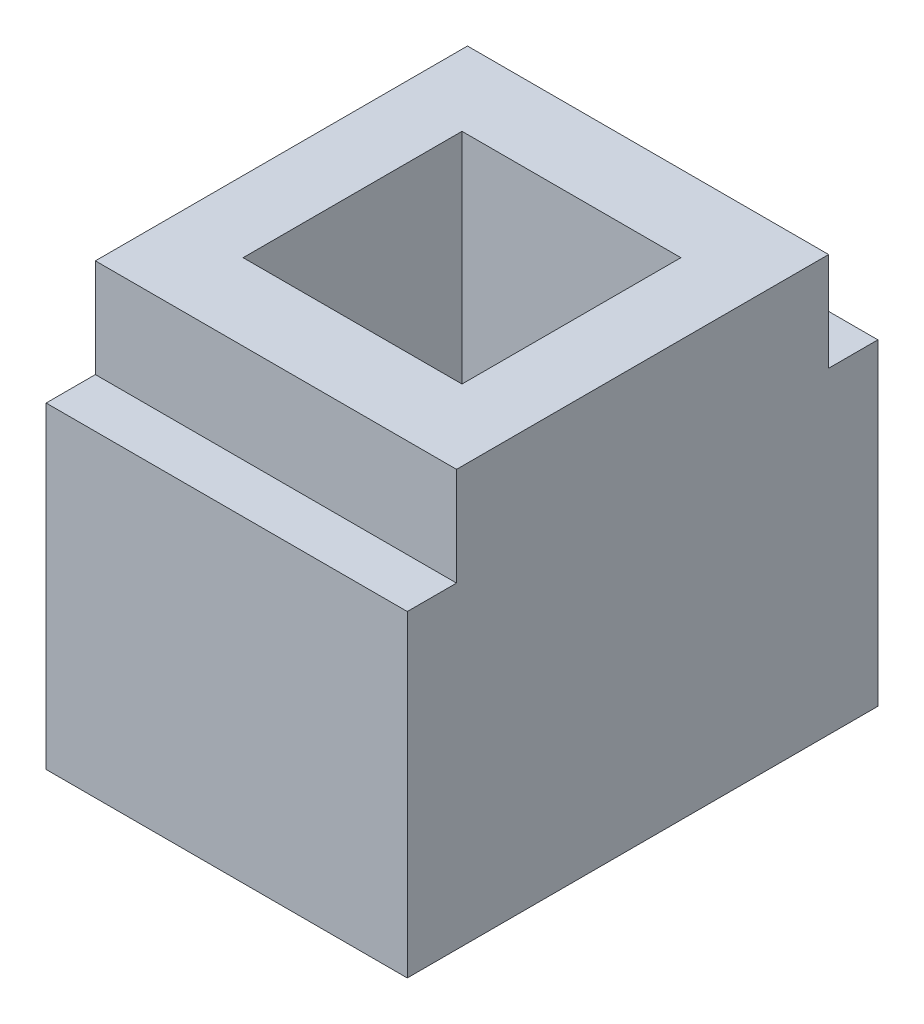
ISO-10303-21;
HEADER;
FILE_DESCRIPTION(('STEP AP214'),'2;1');
FILE_NAME('part.step','',(''),(''),'','','');
FILE_SCHEMA(('AUTOMOTIVE_DESIGN { 1 0 10303 214 1 1 1 1 }'));
ENDSEC;
DATA;
#1=APPLICATION_CONTEXT('core data for automotive mechanical design processes');
#2=APPLICATION_PROTOCOL_DEFINITION('international standard','automotive_design',2000,#1);
#3=PRODUCT_CONTEXT('',#1,'mechanical');
#4=PRODUCT('Part','Part','',(#3));
#5=PRODUCT_RELATED_PRODUCT_CATEGORY('part','',(#4));
#6=PRODUCT_DEFINITION_FORMATION('','',#4);
#7=PRODUCT_DEFINITION_CONTEXT('part definition',#1,'design');
#8=PRODUCT_DEFINITION('design','',#6,#7);
#9=PRODUCT_DEFINITION_SHAPE('','',#8);
#10=(LENGTH_UNIT() NAMED_UNIT(*) SI_UNIT(.MILLI.,.METRE.));
#11=(NAMED_UNIT(*) PLANE_ANGLE_UNIT() SI_UNIT($,.RADIAN.));
#12=(NAMED_UNIT(*) SI_UNIT($,.STERADIAN.) SOLID_ANGLE_UNIT());
#13=UNCERTAINTY_MEASURE_WITH_UNIT(LENGTH_MEASURE(1.E-05),#10,'distance_accuracy_value','');
#14=(GEOMETRIC_REPRESENTATION_CONTEXT(3) GLOBAL_UNCERTAINTY_ASSIGNED_CONTEXT((#13)) GLOBAL_UNIT_ASSIGNED_CONTEXT((#10,
#11,#12)) REPRESENTATION_CONTEXT('',''));
#15=CARTESIAN_POINT('',(0.,0.,0.));
#16=DIRECTION('',(0.,0.,1.));
#17=DIRECTION('',(1.,0.,0.));
#18=AXIS2_PLACEMENT_3D('',#15,#16,#17);
#19=CARTESIAN_POINT('',(33.,0.,-34.));
#20=DIRECTION('',(0.,0.,-1.));
#21=DIRECTION('',(-1.,0.,0.));
#22=AXIS2_PLACEMENT_3D('',#19,#20,#21);
#23=PLANE('',#22);
#24=DIRECTION('',(0.,-1.,0.));
#25=VECTOR('',#24,1.);
#26=CARTESIAN_POINT('',(-33.,0.,-34.));
#27=LINE('',#26,#25);
#28=CARTESIAN_POINT('',(-33.,38.,-34.));
#29=VERTEX_POINT('',#28);
#30=CARTESIAN_POINT('',(-33.,20.,-34.));
#31=VERTEX_POINT('',#30);
#32=EDGE_CURVE('E161',#29,#31,#27,.T.);
#33=ORIENTED_EDGE('',*,*,#32,.F.);
#34=DIRECTION('',(-1.,0.,0.));
#35=VECTOR('',#34,1.);
#36=CARTESIAN_POINT('',(33.,38.,-34.));
#37=LINE('',#36,#35);
#38=CARTESIAN_POINT('',(33.,38.,-34.));
#39=VERTEX_POINT('',#38);
#40=EDGE_CURVE('E11',#39,#29,#37,.T.);
#41=ORIENTED_EDGE('',*,*,#40,.F.);
#42=DIRECTION('',(0.,-1.,0.));
#43=VECTOR('',#42,1.);
#44=CARTESIAN_POINT('',(33.,0.,-34.));
#45=LINE('',#44,#43);
#46=CARTESIAN_POINT('',(33.,20.,-34.));
#47=VERTEX_POINT('',#46);
#48=EDGE_CURVE('E165',#39,#47,#45,.T.);
#49=ORIENTED_EDGE('',*,*,#48,.T.);
#50=DIRECTION('',(-1.,0.,0.));
#51=VECTOR('',#50,1.);
#52=CARTESIAN_POINT('',(33.,20.,-34.));
#53=LINE('',#52,#51);
#54=EDGE_CURVE('E186',#47,#31,#53,.T.);
#55=ORIENTED_EDGE('',*,*,#54,.T.);
#56=EDGE_LOOP('',(#33,#41,#49,#55));
#57=FACE_BOUND('',#56,.T.);
#58=ADVANCED_FACE('F41',(#57),#23,.T.);
#59=CARTESIAN_POINT('',(33.,38.,0.));
#60=DIRECTION('',(0.,1.,0.));
#61=DIRECTION('',(0.,0.,1.));
#62=AXIS2_PLACEMENT_3D('',#59,#60,#61);
#63=PLANE('',#62);
#64=DIRECTION('',(0.,0.,1.));
#65=VECTOR('',#64,1.);
#66=CARTESIAN_POINT('',(-20.,38.,-20.));
#67=LINE('',#66,#65);
#68=CARTESIAN_POINT('',(-20.,38.,-20.));
#69=VERTEX_POINT('',#68);
#70=CARTESIAN_POINT('',(-20.,38.,20.));
#71=VERTEX_POINT('',#70);
#72=EDGE_CURVE('E55',#69,#71,#67,.T.);
#73=ORIENTED_EDGE('',*,*,#72,.F.);
#74=DIRECTION('',(-1.,0.,0.));
#75=VECTOR('',#74,1.);
#76=CARTESIAN_POINT('',(-20.,38.,-20.));
#77=LINE('',#76,#75);
#78=CARTESIAN_POINT('',(20.,38.,-20.));
#79=VERTEX_POINT('',#78);
#80=EDGE_CURVE('E146',#79,#69,#77,.T.);
#81=ORIENTED_EDGE('',*,*,#80,.F.);
#82=DIRECTION('',(0.,0.,-1.));
#83=VECTOR('',#82,1.);
#84=CARTESIAN_POINT('',(20.,38.,-20.));
#85=LINE('',#84,#83);
#86=CARTESIAN_POINT('',(20.,38.,20.));
#87=VERTEX_POINT('',#86);
#88=EDGE_CURVE('E149',#87,#79,#85,.T.);
#89=ORIENTED_EDGE('',*,*,#88,.F.);
#90=DIRECTION('',(1.,0.,0.));
#91=VECTOR('',#90,1.);
#92=CARTESIAN_POINT('',(-20.,38.,20.));
#93=LINE('',#92,#91);
#94=EDGE_CURVE('E155',#71,#87,#93,.T.);
#95=ORIENTED_EDGE('',*,*,#94,.F.);
#96=EDGE_LOOP('',(#73,#81,#89,#95));
#97=FACE_BOUND('',#96,.T.);
#98=DIRECTION('',(0.,0.,-1.));
#99=VECTOR('',#98,1.);
#100=CARTESIAN_POINT('',(-33.,38.,0.));
#101=LINE('',#100,#99);
#102=CARTESIAN_POINT('',(-33.,38.,34.));
#103=VERTEX_POINT('',#102);
#104=EDGE_CURVE('E189',#103,#29,#101,.T.);
#105=ORIENTED_EDGE('',*,*,#104,.F.);
#106=DIRECTION('',(-1.,0.,0.));
#107=VECTOR('',#106,1.);
#108=CARTESIAN_POINT('',(33.,38.,34.));
#109=LINE('',#108,#107);
#110=CARTESIAN_POINT('',(33.,38.,34.));
#111=VERTEX_POINT('',#110);
#112=EDGE_CURVE('E48',#111,#103,#109,.T.);
#113=ORIENTED_EDGE('',*,*,#112,.F.);
#114=DIRECTION('',(0.,0.,-1.));
#115=VECTOR('',#114,1.);
#116=CARTESIAN_POINT('',(33.,38.,0.));
#117=LINE('',#116,#115);
#118=EDGE_CURVE('E168',#111,#39,#117,.T.);
#119=ORIENTED_EDGE('',*,*,#118,.T.);
#120=ORIENTED_EDGE('',*,*,#40,.T.);
#121=EDGE_LOOP('',(#105,#113,#119,#120));
#122=FACE_BOUND('',#121,.T.);
#123=ADVANCED_FACE('F231',(#97,#122),#63,.T.);
#124=CARTESIAN_POINT('',(33.,0.,34.));
#125=DIRECTION('',(0.,0.,-1.));
#126=DIRECTION('',(-1.,0.,0.));
#127=AXIS2_PLACEMENT_3D('',#124,#125,#126);
#128=PLANE('',#127);
#129=DIRECTION('',(0.,-1.,0.));
#130=VECTOR('',#129,1.);
#131=CARTESIAN_POINT('',(-33.,0.,34.));
#132=LINE('',#131,#130);
#133=CARTESIAN_POINT('',(-33.,20.,34.));
#134=VERTEX_POINT('',#133);
#135=EDGE_CURVE('E192',#103,#134,#132,.T.);
#136=ORIENTED_EDGE('',*,*,#135,.T.);
#137=DIRECTION('',(-1.,0.,0.));
#138=VECTOR('',#137,1.);
#139=CARTESIAN_POINT('',(33.,20.,34.));
#140=LINE('',#139,#138);
#141=CARTESIAN_POINT('',(33.,20.,34.));
#142=VERTEX_POINT('',#141);
#143=EDGE_CURVE('E218',#142,#134,#140,.T.);
#144=ORIENTED_EDGE('',*,*,#143,.F.);
#145=DIRECTION('',(0.,-1.,0.));
#146=VECTOR('',#145,1.);
#147=CARTESIAN_POINT('',(33.,0.,34.));
#148=LINE('',#147,#146);
#149=EDGE_CURVE('E172',#111,#142,#148,.T.);
#150=ORIENTED_EDGE('',*,*,#149,.F.);
#151=ORIENTED_EDGE('',*,*,#112,.T.);
#152=EDGE_LOOP('',(#136,#144,#150,#151));
#153=FACE_BOUND('',#152,.T.);
#154=ADVANCED_FACE('F222',(#153),#128,.F.);
#155=CARTESIAN_POINT('',(33.,20.,0.));
#156=DIRECTION('',(0.,1.,0.));
#157=DIRECTION('',(0.,0.,1.));
#158=AXIS2_PLACEMENT_3D('',#155,#156,#157);
#159=PLANE('',#158);
#160=DIRECTION('',(0.,0.,-1.));
#161=VECTOR('',#160,1.);
#162=CARTESIAN_POINT('',(-33.,20.,0.));
#163=LINE('',#162,#161);
#164=CARTESIAN_POINT('',(-33.,20.,43.));
#165=VERTEX_POINT('',#164);
#166=EDGE_CURVE('E195',#165,#134,#163,.T.);
#167=ORIENTED_EDGE('',*,*,#166,.F.);
#168=DIRECTION('',(-1.,0.,0.));
#169=VECTOR('',#168,1.);
#170=CARTESIAN_POINT('',(33.,20.,43.));
#171=LINE('',#170,#169);
#172=CARTESIAN_POINT('',(33.,20.,43.));
#173=VERTEX_POINT('',#172);
#174=EDGE_CURVE('E216',#173,#165,#171,.T.);
#175=ORIENTED_EDGE('',*,*,#174,.F.);
#176=DIRECTION('',(0.,0.,-1.));
#177=VECTOR('',#176,1.);
#178=CARTESIAN_POINT('',(33.,20.,0.));
#179=LINE('',#178,#177);
#180=EDGE_CURVE('E174',#173,#142,#179,.T.);
#181=ORIENTED_EDGE('',*,*,#180,.T.);
#182=ORIENTED_EDGE('',*,*,#143,.T.);
#183=EDGE_LOOP('',(#167,#175,#181,#182));
#184=FACE_BOUND('',#183,.T.);
#185=ADVANCED_FACE('F249',(#184),#159,.T.);
#186=CARTESIAN_POINT('',(33.,0.,43.));
#187=DIRECTION('',(0.,0.,-1.));
#188=DIRECTION('',(-1.,0.,0.));
#189=AXIS2_PLACEMENT_3D('',#186,#187,#188);
#190=PLANE('',#189);
#191=DIRECTION('',(0.,-1.,0.));
#192=VECTOR('',#191,1.);
#193=CARTESIAN_POINT('',(-33.,0.,43.));
#194=LINE('',#193,#192);
#195=CARTESIAN_POINT('',(-33.,-38.,43.));
#196=VERTEX_POINT('',#195);
#197=EDGE_CURVE('E198',#165,#196,#194,.T.);
#198=ORIENTED_EDGE('',*,*,#197,.T.);
#199=DIRECTION('',(-1.,0.,0.));
#200=VECTOR('',#199,1.);
#201=CARTESIAN_POINT('',(33.,-38.,43.));
#202=LINE('',#201,#200);
#203=CARTESIAN_POINT('',(33.,-38.,43.));
#204=VERTEX_POINT('',#203);
#205=EDGE_CURVE('E213',#204,#196,#202,.T.);
#206=ORIENTED_EDGE('',*,*,#205,.F.);
#207=DIRECTION('',(0.,-1.,0.));
#208=VECTOR('',#207,1.);
#209=CARTESIAN_POINT('',(33.,0.,43.));
#210=LINE('',#209,#208);
#211=EDGE_CURVE('E177',#173,#204,#210,.T.);
#212=ORIENTED_EDGE('',*,*,#211,.F.);
#213=ORIENTED_EDGE('',*,*,#174,.T.);
#214=EDGE_LOOP('',(#198,#206,#212,#213));
#215=FACE_BOUND('',#214,.T.);
#216=ADVANCED_FACE('F278',(#215),#190,.F.);
#217=CARTESIAN_POINT('',(33.,-38.,0.));
#218=DIRECTION('',(0.,1.,0.));
#219=DIRECTION('',(0.,0.,1.));
#220=AXIS2_PLACEMENT_3D('',#217,#218,#219);
#221=PLANE('',#220);
#222=DIRECTION('',(-1.,0.,0.));
#223=VECTOR('',#222,1.);
#224=CARTESIAN_POINT('',(-20.,-38.,-20.));
#225=LINE('',#224,#223);
#226=CARTESIAN_POINT('',(20.,-38.,-20.));
#227=VERTEX_POINT('',#226);
#228=CARTESIAN_POINT('',(-20.,-38.,-20.));
#229=VERTEX_POINT('',#228);
#230=EDGE_CURVE('E136',#227,#229,#225,.T.);
#231=ORIENTED_EDGE('',*,*,#230,.T.);
#232=DIRECTION('',(0.,0.,1.));
#233=VECTOR('',#232,1.);
#234=CARTESIAN_POINT('',(-20.,-38.,-20.));
#235=LINE('',#234,#233);
#236=CARTESIAN_POINT('',(-20.,-38.,20.));
#237=VERTEX_POINT('',#236);
#238=EDGE_CURVE('E130',#229,#237,#235,.T.);
#239=ORIENTED_EDGE('',*,*,#238,.T.);
#240=DIRECTION('',(1.,0.,0.));
#241=VECTOR('',#240,1.);
#242=CARTESIAN_POINT('',(-20.,-38.,20.));
#243=LINE('',#242,#241);
#244=CARTESIAN_POINT('',(20.,-38.,20.));
#245=VERTEX_POINT('',#244);
#246=EDGE_CURVE('E139',#237,#245,#243,.T.);
#247=ORIENTED_EDGE('',*,*,#246,.T.);
#248=DIRECTION('',(0.,0.,-1.));
#249=VECTOR('',#248,1.);
#250=CARTESIAN_POINT('',(20.,-38.,-20.));
#251=LINE('',#250,#249);
#252=EDGE_CURVE('E63',#245,#227,#251,.T.);
#253=ORIENTED_EDGE('',*,*,#252,.T.);
#254=EDGE_LOOP('',(#231,#239,#247,#253));
#255=FACE_BOUND('',#254,.T.);
#256=DIRECTION('',(0.,0.,-1.));
#257=VECTOR('',#256,1.);
#258=CARTESIAN_POINT('',(-33.,-38.,0.));
#259=LINE('',#258,#257);
#260=CARTESIAN_POINT('',(-33.,-38.,-43.));
#261=VERTEX_POINT('',#260);
#262=EDGE_CURVE('E200',#196,#261,#259,.T.);
#263=ORIENTED_EDGE('',*,*,#262,.T.);
#264=DIRECTION('',(-1.,0.,0.));
#265=VECTOR('',#264,1.);
#266=CARTESIAN_POINT('',(33.,-38.,-43.));
#267=LINE('',#266,#265);
#268=CARTESIAN_POINT('',(33.,-38.,-43.));
#269=VERTEX_POINT('',#268);
#270=EDGE_CURVE('E211',#269,#261,#267,.T.);
#271=ORIENTED_EDGE('',*,*,#270,.F.);
#272=DIRECTION('',(0.,0.,-1.));
#273=VECTOR('',#272,1.);
#274=CARTESIAN_POINT('',(33.,-38.,0.));
#275=LINE('',#274,#273);
#276=EDGE_CURVE('E179',#204,#269,#275,.T.);
#277=ORIENTED_EDGE('',*,*,#276,.F.);
#278=ORIENTED_EDGE('',*,*,#205,.T.);
#279=EDGE_LOOP('',(#263,#271,#277,#278));
#280=FACE_BOUND('',#279,.T.);
#281=ADVANCED_FACE('F143',(#255,#280),#221,.F.);
#282=CARTESIAN_POINT('',(33.,0.,-43.));
#283=DIRECTION('',(0.,0.,-1.));
#284=DIRECTION('',(-1.,0.,0.));
#285=AXIS2_PLACEMENT_3D('',#282,#283,#284);
#286=PLANE('',#285);
#287=DIRECTION('',(0.,-1.,0.));
#288=VECTOR('',#287,1.);
#289=CARTESIAN_POINT('',(-33.,0.,-43.));
#290=LINE('',#289,#288);
#291=CARTESIAN_POINT('',(-33.,20.,-43.));
#292=VERTEX_POINT('',#291);
#293=EDGE_CURVE('E203',#292,#261,#290,.T.);
#294=ORIENTED_EDGE('',*,*,#293,.F.);
#295=DIRECTION('',(-1.,0.,0.));
#296=VECTOR('',#295,1.);
#297=CARTESIAN_POINT('',(33.,20.,-43.));
#298=LINE('',#297,#296);
#299=CARTESIAN_POINT('',(33.,20.,-43.));
#300=VERTEX_POINT('',#299);
#301=EDGE_CURVE('E209',#300,#292,#298,.T.);
#302=ORIENTED_EDGE('',*,*,#301,.F.);
#303=DIRECTION('',(0.,-1.,0.));
#304=VECTOR('',#303,1.);
#305=CARTESIAN_POINT('',(33.,0.,-43.));
#306=LINE('',#305,#304);
#307=EDGE_CURVE('E181',#300,#269,#306,.T.);
#308=ORIENTED_EDGE('',*,*,#307,.T.);
#309=ORIENTED_EDGE('',*,*,#270,.T.);
#310=EDGE_LOOP('',(#294,#302,#308,#309));
#311=FACE_BOUND('',#310,.T.);
#312=ADVANCED_FACE('F241',(#311),#286,.T.);
#313=CARTESIAN_POINT('',(33.,20.,0.));
#314=DIRECTION('',(0.,-1.,0.));
#315=DIRECTION('',(0.,0.,-1.));
#316=AXIS2_PLACEMENT_3D('',#313,#314,#315);
#317=PLANE('',#316);
#318=DIRECTION('',(0.,0.,1.));
#319=VECTOR('',#318,1.);
#320=CARTESIAN_POINT('',(-33.,20.,0.));
#321=LINE('',#320,#319);
#322=EDGE_CURVE('E169',#292,#31,#321,.T.);
#323=ORIENTED_EDGE('',*,*,#322,.T.);
#324=ORIENTED_EDGE('',*,*,#54,.F.);
#325=DIRECTION('',(0.,0.,1.));
#326=VECTOR('',#325,1.);
#327=CARTESIAN_POINT('',(33.,20.,0.));
#328=LINE('',#327,#326);
#329=EDGE_CURVE('E184',#300,#47,#328,.T.);
#330=ORIENTED_EDGE('',*,*,#329,.F.);
#331=ORIENTED_EDGE('',*,*,#301,.T.);
#332=EDGE_LOOP('',(#323,#324,#330,#331));
#333=FACE_BOUND('',#332,.T.);
#334=ADVANCED_FACE('F254',(#333),#317,.F.);
#335=CARTESIAN_POINT('',(33.,0.,0.));
#336=DIRECTION('',(1.,0.,0.));
#337=DIRECTION('',(0.,0.,-1.));
#338=AXIS2_PLACEMENT_3D('',#335,#336,#337);
#339=PLANE('',#338);
#340=ORIENTED_EDGE('',*,*,#48,.F.);
#341=ORIENTED_EDGE('',*,*,#118,.F.);
#342=ORIENTED_EDGE('',*,*,#149,.T.);
#343=ORIENTED_EDGE('',*,*,#180,.F.);
#344=ORIENTED_EDGE('',*,*,#211,.T.);
#345=ORIENTED_EDGE('',*,*,#276,.T.);
#346=ORIENTED_EDGE('',*,*,#307,.F.);
#347=ORIENTED_EDGE('',*,*,#329,.T.);
#348=EDGE_LOOP('',(#340,#341,#342,#343,#344,#345,#346,#347));
#349=FACE_BOUND('',#348,.T.);
#350=ADVANCED_FACE('F253',(#349),#339,.T.);
#351=CARTESIAN_POINT('',(-33.,0.,0.));
#352=DIRECTION('',(1.,0.,0.));
#353=DIRECTION('',(0.,0.,-1.));
#354=AXIS2_PLACEMENT_3D('',#351,#352,#353);
#355=PLANE('',#354);
#356=ORIENTED_EDGE('',*,*,#32,.T.);
#357=ORIENTED_EDGE('',*,*,#322,.F.);
#358=ORIENTED_EDGE('',*,*,#293,.T.);
#359=ORIENTED_EDGE('',*,*,#262,.F.);
#360=ORIENTED_EDGE('',*,*,#197,.F.);
#361=ORIENTED_EDGE('',*,*,#166,.T.);
#362=ORIENTED_EDGE('',*,*,#135,.F.);
#363=ORIENTED_EDGE('',*,*,#104,.T.);
#364=EDGE_LOOP('',(#356,#357,#358,#359,#360,#361,#362,#363));
#365=FACE_BOUND('',#364,.T.);
#366=ADVANCED_FACE('F228',(#365),#355,.F.);
#367=CARTESIAN_POINT('',(-20.,-38.,-20.));
#368=DIRECTION('',(-1.,0.,0.));
#369=DIRECTION('',(0.,0.,1.));
#370=AXIS2_PLACEMENT_3D('',#367,#368,#369);
#371=PLANE('',#370);
#372=ORIENTED_EDGE('',*,*,#72,.T.);
#373=DIRECTION('',(0.,1.,0.));
#374=VECTOR('',#373,1.);
#375=CARTESIAN_POINT('',(-20.,-38.,20.));
#376=LINE('',#375,#374);
#377=EDGE_CURVE('E126',#237,#71,#376,.T.);
#378=ORIENTED_EDGE('',*,*,#377,.F.);
#379=ORIENTED_EDGE('',*,*,#238,.F.);
#380=DIRECTION('',(0.,1.,0.));
#381=VECTOR('',#380,1.);
#382=CARTESIAN_POINT('',(-20.,-38.,-20.));
#383=LINE('',#382,#381);
#384=EDGE_CURVE('E159',#229,#69,#383,.T.);
#385=ORIENTED_EDGE('',*,*,#384,.T.);
#386=EDGE_LOOP('',(#372,#378,#379,#385));
#387=FACE_BOUND('',#386,.T.);
#388=ADVANCED_FACE('F128',(#387),#371,.F.);
#389=CARTESIAN_POINT('',(-20.,-38.,-20.));
#390=DIRECTION('',(0.,0.,-1.));
#391=DIRECTION('',(-1.,0.,0.));
#392=AXIS2_PLACEMENT_3D('',#389,#390,#391);
#393=PLANE('',#392);
#394=ORIENTED_EDGE('',*,*,#80,.T.);
#395=ORIENTED_EDGE('',*,*,#384,.F.);
#396=ORIENTED_EDGE('',*,*,#230,.F.);
#397=DIRECTION('',(0.,1.,0.));
#398=VECTOR('',#397,1.);
#399=CARTESIAN_POINT('',(20.,-38.,-20.));
#400=LINE('',#399,#398);
#401=EDGE_CURVE('E162',#227,#79,#400,.T.);
#402=ORIENTED_EDGE('',*,*,#401,.T.);
#403=EDGE_LOOP('',(#394,#395,#396,#402));
#404=FACE_BOUND('',#403,.T.);
#405=ADVANCED_FACE('F291',(#404),#393,.F.);
#406=CARTESIAN_POINT('',(20.,-38.,-20.));
#407=DIRECTION('',(1.,0.,0.));
#408=DIRECTION('',(0.,0.,-1.));
#409=AXIS2_PLACEMENT_3D('',#406,#407,#408);
#410=PLANE('',#409);
#411=ORIENTED_EDGE('',*,*,#88,.T.);
#412=ORIENTED_EDGE('',*,*,#401,.F.);
#413=ORIENTED_EDGE('',*,*,#252,.F.);
#414=DIRECTION('',(0.,1.,0.));
#415=VECTOR('',#414,1.);
#416=CARTESIAN_POINT('',(20.,-38.,20.));
#417=LINE('',#416,#415);
#418=EDGE_CURVE('E135',#245,#87,#417,.T.);
#419=ORIENTED_EDGE('',*,*,#418,.T.);
#420=EDGE_LOOP('',(#411,#412,#413,#419));
#421=FACE_BOUND('',#420,.T.);
#422=ADVANCED_FACE('F299',(#421),#410,.F.);
#423=CARTESIAN_POINT('',(-20.,-38.,20.));
#424=DIRECTION('',(0.,0.,1.));
#425=DIRECTION('',(1.,0.,0.));
#426=AXIS2_PLACEMENT_3D('',#423,#424,#425);
#427=PLANE('',#426);
#428=ORIENTED_EDGE('',*,*,#94,.T.);
#429=ORIENTED_EDGE('',*,*,#418,.F.);
#430=ORIENTED_EDGE('',*,*,#246,.F.);
#431=ORIENTED_EDGE('',*,*,#377,.T.);
#432=EDGE_LOOP('',(#428,#429,#430,#431));
#433=FACE_BOUND('',#432,.T.);
#434=ADVANCED_FACE('F140',(#433),#427,.F.);
#435=CLOSED_SHELL('',(#58,#123,#154,#185,#216,#281,#312,#334,#350,#366,#388,#405,#422,#434));
#436=MANIFOLD_SOLID_BREP('B2',#435);
#437=ADVANCED_BREP_SHAPE_REPRESENTATION('',(#18,#436),#14);
#438=SHAPE_DEFINITION_REPRESENTATION(#9,#437);
ENDSEC;
END-ISO-10303-21;
